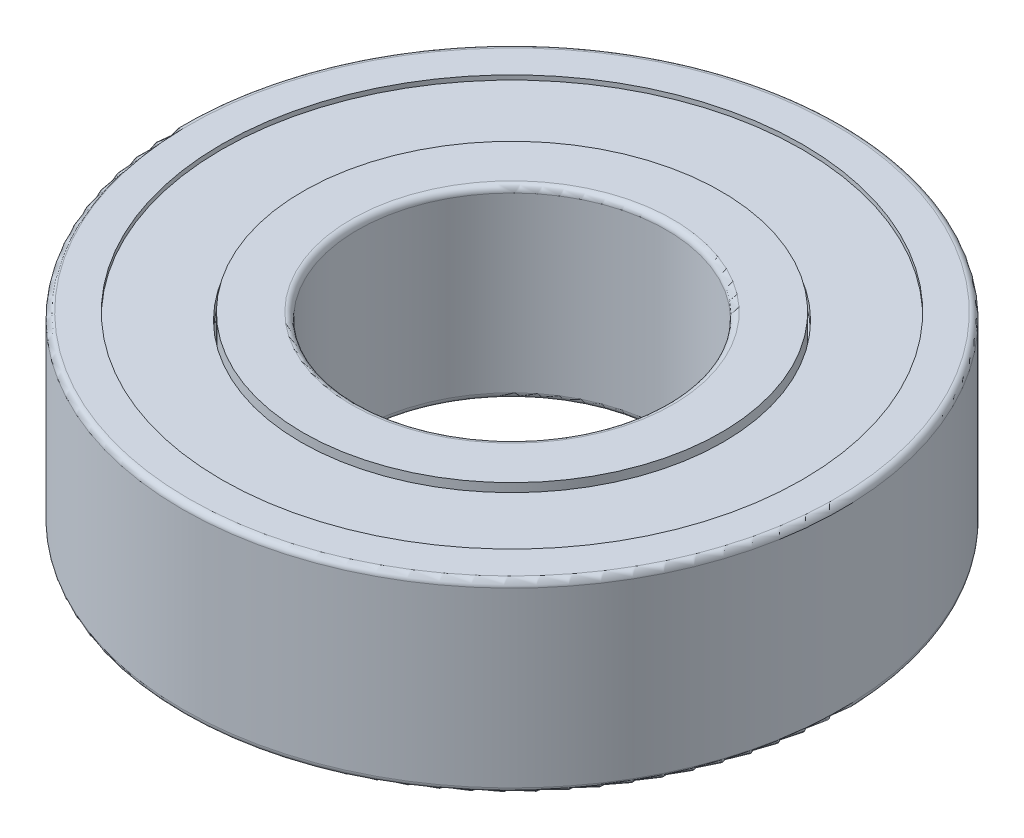
ISO-10303-21;
HEADER;
FILE_DESCRIPTION(('STEP AP214'),'2;1');
FILE_NAME('part.step','',(''),(''),'','','');
FILE_SCHEMA(('AUTOMOTIVE_DESIGN { 1 0 10303 214 1 1 1 1 }'));
ENDSEC;
DATA;
#1=APPLICATION_CONTEXT('core data for automotive mechanical design processes');
#2=APPLICATION_PROTOCOL_DEFINITION('international standard','automotive_design',2000,#1);
#3=PRODUCT_CONTEXT('',#1,'mechanical');
#4=PRODUCT('Part','Part','',(#3));
#5=PRODUCT_RELATED_PRODUCT_CATEGORY('part','',(#4));
#6=PRODUCT_DEFINITION_FORMATION('','',#4);
#7=PRODUCT_DEFINITION_CONTEXT('part definition',#1,'design');
#8=PRODUCT_DEFINITION('design','',#6,#7);
#9=PRODUCT_DEFINITION_SHAPE('','',#8);
#10=(LENGTH_UNIT() NAMED_UNIT(*) SI_UNIT(.MILLI.,.METRE.));
#11=(NAMED_UNIT(*) PLANE_ANGLE_UNIT() SI_UNIT($,.RADIAN.));
#12=(NAMED_UNIT(*) SI_UNIT($,.STERADIAN.) SOLID_ANGLE_UNIT());
#13=UNCERTAINTY_MEASURE_WITH_UNIT(LENGTH_MEASURE(1.E-05),#10,'distance_accuracy_value','');
#14=(GEOMETRIC_REPRESENTATION_CONTEXT(3) GLOBAL_UNCERTAINTY_ASSIGNED_CONTEXT((#13)) GLOBAL_UNIT_ASSIGNED_CONTEXT((#10,
#11,#12)) REPRESENTATION_CONTEXT('',''));
#15=CARTESIAN_POINT('',(0.,0.,0.));
#16=DIRECTION('',(0.,0.,1.));
#17=DIRECTION('',(1.,0.,0.));
#18=AXIS2_PLACEMENT_3D('',#15,#16,#17);
#19=CARTESIAN_POINT('',(-9.00102220664808,0.,7.55275441381673));
#20=DIRECTION('',(0.,1.,0.));
#21=DIRECTION('',(0.766044443118986,0.,-0.64278760968653));
#22=AXIS2_PLACEMENT_3D('',#19,#20,#21);
#23=SPHERICAL_SURFACE('',#22,2.38);
#24=CARTESIAN_POINT('',(-9.00102220664808,2.38,7.55275441381673));
#25=VERTEX_POINT('',#24);
#26=VERTEX_LOOP('',#25);
#27=FACE_BOUND('',#26,.T.);
#28=ADVANCED_FACE('F35',(#27),#23,.T.);
#29=CLOSED_SHELL('',(#28));
#30=MANIFOLD_SOLID_BREP('B2',#29);
#31=CARTESIAN_POINT('',(-2.04036608758655,0.,11.5714910978934));
#32=DIRECTION('',(0.,1.,0.));
#33=DIRECTION('',(0.17364817766694,0.,-0.984807753012206));
#34=AXIS2_PLACEMENT_3D('',#31,#32,#33);
#35=SPHERICAL_SURFACE('',#34,2.38);
#36=CARTESIAN_POINT('',(-2.04036608758655,2.38,11.5714910978934));
#37=VERTEX_POINT('',#36);
#38=VERTEX_LOOP('',#37);
#39=FACE_BOUND('',#38,.T.);
#40=ADVANCED_FACE('F53',(#39),#35,.T.);
#41=CLOSED_SHELL('',(#40));
#42=MANIFOLD_SOLID_BREP('B6',#41);
#43=CARTESIAN_POINT('',(5.87499999999991,0.,10.1757984944672));
#44=DIRECTION('',(0.,1.,0.));
#45=DIRECTION('',(-0.499999999999992,0.,-0.866025403784443));
#46=AXIS2_PLACEMENT_3D('',#43,#44,#45);
#47=SPHERICAL_SURFACE('',#46,2.38);
#48=CARTESIAN_POINT('',(5.87499999999991,2.38,10.1757984944672));
#49=VERTEX_POINT('',#48);
#50=VERTEX_LOOP('',#49);
#51=FACE_BOUND('',#50,.T.);
#52=ADVANCED_FACE('F71',(#51),#47,.T.);
#53=CLOSED_SHELL('',(#52));
#54=MANIFOLD_SOLID_BREP('B31',#53);
#55=CARTESIAN_POINT('',(11.0413882942344,0.,4.01873668407669));
#56=DIRECTION('',(0.,1.,0.));
#57=DIRECTION('',(-0.939692620785906,0.,-0.342020143325676));
#58=AXIS2_PLACEMENT_3D('',#55,#56,#57);
#59=SPHERICAL_SURFACE('',#58,2.38);
#60=CARTESIAN_POINT('',(11.0413882942344,2.38,4.01873668407669));
#61=VERTEX_POINT('',#60);
#62=VERTEX_LOOP('',#61);
#63=FACE_BOUND('',#62,.T.);
#64=ADVANCED_FACE('F89',(#63),#59,.T.);
#65=CLOSED_SHELL('',(#64));
#66=MANIFOLD_SOLID_BREP('B49',#65);
#67=CARTESIAN_POINT('',(11.0413882942344,0.,-4.01873668407654));
#68=DIRECTION('',(0.,1.,0.));
#69=DIRECTION('',(-0.939692620785911,0.,0.342020143325663));
#70=AXIS2_PLACEMENT_3D('',#67,#68,#69);
#71=SPHERICAL_SURFACE('',#70,2.38);
#72=CARTESIAN_POINT('',(11.0413882942344,2.38,-4.01873668407654));
#73=VERTEX_POINT('',#72);
#74=VERTEX_LOOP('',#73);
#75=FACE_BOUND('',#74,.T.);
#76=ADVANCED_FACE('F107',(#75),#71,.T.);
#77=CLOSED_SHELL('',(#76));
#78=MANIFOLD_SOLID_BREP('B67',#77);
#79=CARTESIAN_POINT('',(5.87500000000005,0.,-10.1757984944671));
#80=DIRECTION('',(0.,1.,0.));
#81=DIRECTION('',(-0.500000000000004,0.,0.866025403784436));
#82=AXIS2_PLACEMENT_3D('',#79,#80,#81);
#83=SPHERICAL_SURFACE('',#82,2.38);
#84=CARTESIAN_POINT('',(5.87500000000005,2.38,-10.1757984944671));
#85=VERTEX_POINT('',#84);
#86=VERTEX_LOOP('',#85);
#87=FACE_BOUND('',#86,.T.);
#88=ADVANCED_FACE('F125',(#87),#83,.T.);
#89=CLOSED_SHELL('',(#88));
#90=MANIFOLD_SOLID_BREP('B85',#89);
#91=CARTESIAN_POINT('',(-2.0403660875864,0.,-11.5714910978934));
#92=DIRECTION('',(0.,1.,0.));
#93=DIRECTION('',(0.173648177666927,0.,0.984807753012209));
#94=AXIS2_PLACEMENT_3D('',#91,#92,#93);
#95=SPHERICAL_SURFACE('',#94,2.38);
#96=CARTESIAN_POINT('',(-2.0403660875864,2.38,-11.5714910978934));
#97=VERTEX_POINT('',#96);
#98=VERTEX_LOOP('',#97);
#99=FACE_BOUND('',#98,.T.);
#100=ADVANCED_FACE('F143',(#99),#95,.T.);
#101=CLOSED_SHELL('',(#100));
#102=MANIFOLD_SOLID_BREP('B103',#101);
#103=CARTESIAN_POINT('',(-9.00102220664798,0.,-7.55275441381685));
#104=DIRECTION('',(0.,1.,0.));
#105=DIRECTION('',(0.766044443118977,0.,0.642787609686541));
#106=AXIS2_PLACEMENT_3D('',#103,#104,#105);
#107=SPHERICAL_SURFACE('',#106,2.38);
#108=CARTESIAN_POINT('',(-9.00102220664798,2.38,-7.55275441381685));
#109=VERTEX_POINT('',#108);
#110=VERTEX_LOOP('',#109);
#111=FACE_BOUND('',#110,.T.);
#112=ADVANCED_FACE('F163',(#111),#107,.T.);
#113=CLOSED_SHELL('',(#112));
#114=MANIFOLD_SOLID_BREP('B121',#113);
#115=CARTESIAN_POINT('',(0.,4.95,0.));
#116=DIRECTION('',(0.,1.,0.));
#117=DIRECTION('',(0.,0.,1.));
#118=AXIS2_PLACEMENT_3D('',#115,#116,#117);
#119=CYLINDRICAL_SURFACE('',#118,14.1);
#120=CARTESIAN_POINT('',(0.,-4.5,0.));
#121=DIRECTION('',(0.,1.,0.));
#122=DIRECTION('',(0.,0.,1.));
#123=AXIS2_PLACEMENT_3D('',#120,#121,#122);
#124=CIRCLE('',#123,14.1);
#125=CARTESIAN_POINT('',(0.,-4.5,14.1));
#126=VERTEX_POINT('',#125);
#127=EDGE_CURVE('E209',#126,#126,#124,.T.);
#128=ORIENTED_EDGE('',*,*,#127,.F.);
#129=EDGE_LOOP('',(#128));
#130=FACE_BOUND('',#129,.T.);
#131=CARTESIAN_POINT('',(0.,-4.28,0.));
#132=DIRECTION('',(0.,1.,0.));
#133=DIRECTION('',(0.,0.,1.));
#134=AXIS2_PLACEMENT_3D('',#131,#132,#133);
#135=CIRCLE('',#134,14.1);
#136=CARTESIAN_POINT('',(0.,-4.28,14.1));
#137=VERTEX_POINT('',#136);
#138=EDGE_CURVE('E241',#137,#137,#135,.T.);
#139=ORIENTED_EDGE('',*,*,#138,.T.);
#140=EDGE_LOOP('',(#139));
#141=FACE_BOUND('',#140,.T.);
#142=ADVANCED_FACE('F183',(#130,#141),#119,.F.);
#143=CARTESIAN_POINT('',(0.,-3.995,0.));
#144=DIRECTION('',(0.,1.,0.));
#145=DIRECTION('',(0.,0.,1.));
#146=AXIS2_PLACEMENT_3D('',#143,#144,#145);
#147=TOROIDAL_SURFACE('',#146,14.1,0.285);
#148=CARTESIAN_POINT('',(0.,-4.15,0.));
#149=DIRECTION('',(0.,-1.,0.));
#150=DIRECTION('',(0.,0.,-1.));
#151=AXIS2_PLACEMENT_3D('',#148,#149,#150);
#152=CIRCLE('',#151,14.339165214862);
#153=CARTESIAN_POINT('',(0.,-4.15,-14.339165214862));
#154=VERTEX_POINT('',#153);
#155=EDGE_CURVE('E162',#154,#154,#152,.T.);
#156=ORIENTED_EDGE('',*,*,#155,.F.);
#157=EDGE_LOOP('',(#156));
#158=FACE_BOUND('',#157,.T.);
#159=ORIENTED_EDGE('',*,*,#138,.F.);
#160=EDGE_LOOP('',(#159));
#161=FACE_BOUND('',#160,.T.);
#162=ADVANCED_FACE('F267',(#158,#161),#147,.F.);
#163=CARTESIAN_POINT('',(0.,4.95,0.));
#164=DIRECTION('',(0.,1.,0.));
#165=DIRECTION('',(0.,0.,1.));
#166=AXIS2_PLACEMENT_3D('',#163,#164,#165);
#167=CYLINDRICAL_SURFACE('',#166,13.35);
#168=CARTESIAN_POINT('',(0.,-3.58,0.));
#169=DIRECTION('',(0.,1.,0.));
#170=DIRECTION('',(0.,0.,1.));
#171=AXIS2_PLACEMENT_3D('',#168,#169,#170);
#172=CIRCLE('',#171,13.35);
#173=CARTESIAN_POINT('',(0.,-3.58,13.35));
#174=VERTEX_POINT('',#173);
#175=EDGE_CURVE('E238',#174,#174,#172,.T.);
#176=ORIENTED_EDGE('',*,*,#175,.F.);
#177=EDGE_LOOP('',(#176));
#178=FACE_BOUND('',#177,.T.);
#179=CARTESIAN_POINT('',(0.,-1.76867888549618,0.));
#180=DIRECTION('',(0.,1.,0.));
#181=DIRECTION('',(0.,0.,1.));
#182=AXIS2_PLACEMENT_3D('',#179,#180,#181);
#183=CIRCLE('',#182,13.35);
#184=CARTESIAN_POINT('',(0.,-1.76867888549618,13.35));
#185=VERTEX_POINT('',#184);
#186=EDGE_CURVE('E235',#185,#185,#183,.T.);
#187=ORIENTED_EDGE('',*,*,#186,.T.);
#188=EDGE_LOOP('',(#187));
#189=FACE_BOUND('',#188,.T.);
#190=ADVANCED_FACE('F272',(#178,#189),#167,.F.);
#191=CARTESIAN_POINT('',(0.,0.,0.));
#192=DIRECTION('',(0.,1.,0.));
#193=DIRECTION('',(0.,0.,1.));
#194=AXIS2_PLACEMENT_3D('',#191,#192,#193);
#195=TOROIDAL_SURFACE('',#194,11.75,2.385);
#196=ORIENTED_EDGE('',*,*,#186,.F.);
#197=EDGE_LOOP('',(#196));
#198=FACE_BOUND('',#197,.T.);
#199=CARTESIAN_POINT('',(0.,1.76867888549618,0.));
#200=DIRECTION('',(0.,1.,0.));
#201=DIRECTION('',(0.,0.,1.));
#202=AXIS2_PLACEMENT_3D('',#199,#200,#201);
#203=CIRCLE('',#202,13.35);
#204=CARTESIAN_POINT('',(0.,1.76867888549618,13.35));
#205=VERTEX_POINT('',#204);
#206=EDGE_CURVE('E232',#205,#205,#203,.T.);
#207=ORIENTED_EDGE('',*,*,#206,.T.);
#208=EDGE_LOOP('',(#207));
#209=FACE_BOUND('',#208,.T.);
#210=ADVANCED_FACE('F280',(#198,#209),#195,.F.);
#211=CARTESIAN_POINT('',(0.,4.95,0.));
#212=DIRECTION('',(0.,1.,0.));
#213=DIRECTION('',(0.,0.,1.));
#214=AXIS2_PLACEMENT_3D('',#211,#212,#213);
#215=CYLINDRICAL_SURFACE('',#214,13.35);
#216=ORIENTED_EDGE('',*,*,#206,.F.);
#217=EDGE_LOOP('',(#216));
#218=FACE_BOUND('',#217,.T.);
#219=CARTESIAN_POINT('',(0.,3.58,0.));
#220=DIRECTION('',(0.,-1.,0.));
#221=DIRECTION('',(0.,0.,-1.));
#222=AXIS2_PLACEMENT_3D('',#219,#220,#221);
#223=CIRCLE('',#222,13.35);
#224=CARTESIAN_POINT('',(0.,3.58,-13.35));
#225=VERTEX_POINT('',#224);
#226=EDGE_CURVE('E204',#225,#225,#223,.T.);
#227=ORIENTED_EDGE('',*,*,#226,.F.);
#228=EDGE_LOOP('',(#227));
#229=FACE_BOUND('',#228,.T.);
#230=ADVANCED_FACE('F284',(#218,#229),#215,.F.);
#231=CARTESIAN_POINT('',(0.,3.995,0.));
#232=DIRECTION('',(0.,1.,0.));
#233=DIRECTION('',(0.,0.,1.));
#234=AXIS2_PLACEMENT_3D('',#231,#232,#233);
#235=TOROIDAL_SURFACE('',#234,14.38,0.285);
#236=CARTESIAN_POINT('',(0.,3.7100438630245,0.));
#237=DIRECTION('',(0.,1.,0.));
#238=DIRECTION('',(0.,0.,1.));
#239=AXIS2_PLACEMENT_3D('',#236,#237,#238);
#240=CIRCLE('',#239,14.385);
#241=CARTESIAN_POINT('',(0.,3.7100438630245,14.385));
#242=VERTEX_POINT('',#241);
#243=EDGE_CURVE('E202',#242,#242,#240,.F.);
#244=ORIENTED_EDGE('',*,*,#243,.T.);
#245=EDGE_LOOP('',(#244));
#246=FACE_BOUND('',#245,.T.);
#247=CARTESIAN_POINT('',(0.,4.28,0.));
#248=DIRECTION('',(0.,1.,0.));
#249=DIRECTION('',(0.,0.,1.));
#250=AXIS2_PLACEMENT_3D('',#247,#248,#249);
#251=CIRCLE('',#250,14.38);
#252=CARTESIAN_POINT('',(0.,4.28,14.38));
#253=VERTEX_POINT('',#252);
#254=EDGE_CURVE('E229',#253,#253,#251,.T.);
#255=ORIENTED_EDGE('',*,*,#254,.T.);
#256=EDGE_LOOP('',(#255));
#257=FACE_BOUND('',#256,.T.);
#258=ADVANCED_FACE('F288',(#246,#257),#235,.F.);
#259=CARTESIAN_POINT('',(0.,4.28,0.));
#260=DIRECTION('',(0.,-1.,0.));
#261=DIRECTION('',(0.,0.,-1.));
#262=AXIS2_PLACEMENT_3D('',#259,#260,#261);
#263=PLANE('',#262);
#264=CARTESIAN_POINT('',(0.,4.28,0.));
#265=DIRECTION('',(0.,1.,0.));
#266=DIRECTION('',(0.,0.,1.));
#267=AXIS2_PLACEMENT_3D('',#264,#265,#266);
#268=CIRCLE('',#267,14.1);
#269=CARTESIAN_POINT('',(0.,4.28,14.1));
#270=VERTEX_POINT('',#269);
#271=EDGE_CURVE('E226',#270,#270,#268,.T.);
#272=ORIENTED_EDGE('',*,*,#271,.T.);
#273=EDGE_LOOP('',(#272));
#274=FACE_BOUND('',#273,.T.);
#275=ORIENTED_EDGE('',*,*,#254,.F.);
#276=EDGE_LOOP('',(#275));
#277=FACE_BOUND('',#276,.T.);
#278=ADVANCED_FACE('F292',(#274,#277),#263,.T.);
#279=CARTESIAN_POINT('',(0.,4.95,0.));
#280=DIRECTION('',(0.,1.,0.));
#281=DIRECTION('',(0.,0.,1.));
#282=AXIS2_PLACEMENT_3D('',#279,#280,#281);
#283=CYLINDRICAL_SURFACE('',#282,14.1);
#284=CARTESIAN_POINT('',(0.,4.5,0.));
#285=DIRECTION('',(0.,1.,0.));
#286=DIRECTION('',(0.,0.,1.));
#287=AXIS2_PLACEMENT_3D('',#284,#285,#286);
#288=CIRCLE('',#287,14.1);
#289=CARTESIAN_POINT('',(0.,4.5,14.1));
#290=VERTEX_POINT('',#289);
#291=EDGE_CURVE('E223',#290,#290,#288,.T.);
#292=ORIENTED_EDGE('',*,*,#291,.T.);
#293=EDGE_LOOP('',(#292));
#294=FACE_BOUND('',#293,.T.);
#295=ORIENTED_EDGE('',*,*,#271,.F.);
#296=EDGE_LOOP('',(#295));
#297=FACE_BOUND('',#296,.T.);
#298=ADVANCED_FACE('F295',(#294,#297),#283,.F.);
#299=CARTESIAN_POINT('',(0.,4.5,0.));
#300=DIRECTION('',(0.,1.,0.));
#301=DIRECTION('',(0.,0.,1.));
#302=AXIS2_PLACEMENT_3D('',#299,#300,#301);
#303=PLANE('',#302);
#304=CARTESIAN_POINT('',(0.,4.5,0.));
#305=DIRECTION('',(0.,1.,0.));
#306=DIRECTION('',(0.,0.,1.));
#307=AXIS2_PLACEMENT_3D('',#304,#305,#306);
#308=CIRCLE('',#307,15.7);
#309=CARTESIAN_POINT('',(0.,4.5,15.7));
#310=VERTEX_POINT('',#309);
#311=EDGE_CURVE('E190',#310,#310,#308,.T.);
#312=ORIENTED_EDGE('',*,*,#311,.T.);
#313=EDGE_LOOP('',(#312));
#314=FACE_BOUND('',#313,.T.);
#315=ORIENTED_EDGE('',*,*,#291,.F.);
#316=EDGE_LOOP('',(#315));
#317=FACE_BOUND('',#316,.T.);
#318=ADVANCED_FACE('F299',(#314,#317),#303,.T.);
#319=CARTESIAN_POINT('',(0.,4.95,0.));
#320=DIRECTION('',(0.,1.,0.));
#321=DIRECTION('',(0.,0.,1.));
#322=AXIS2_PLACEMENT_3D('',#319,#320,#321);
#323=CYLINDRICAL_SURFACE('',#322,16.);
#324=CARTESIAN_POINT('',(0.,-4.2,0.));
#325=DIRECTION('',(0.,1.,0.));
#326=DIRECTION('',(0.,0.,1.));
#327=AXIS2_PLACEMENT_3D('',#324,#325,#326);
#328=CIRCLE('',#327,16.);
#329=CARTESIAN_POINT('',(0.,-4.2,16.));
#330=VERTEX_POINT('',#329);
#331=EDGE_CURVE('E199',#330,#330,#328,.T.);
#332=ORIENTED_EDGE('',*,*,#331,.T.);
#333=EDGE_LOOP('',(#332));
#334=FACE_BOUND('',#333,.T.);
#335=CARTESIAN_POINT('',(0.,4.2,0.));
#336=DIRECTION('',(0.,1.,0.));
#337=DIRECTION('',(0.,0.,1.));
#338=AXIS2_PLACEMENT_3D('',#335,#336,#337);
#339=CIRCLE('',#338,16.);
#340=CARTESIAN_POINT('',(0.,4.2,16.));
#341=VERTEX_POINT('',#340);
#342=EDGE_CURVE('E244',#341,#341,#339,.F.);
#343=ORIENTED_EDGE('',*,*,#342,.T.);
#344=EDGE_LOOP('',(#343));
#345=FACE_BOUND('',#344,.T.);
#346=ADVANCED_FACE('F249',(#334,#345),#323,.T.);
#347=CARTESIAN_POINT('',(0.,-4.5,0.));
#348=DIRECTION('',(0.,1.,0.));
#349=DIRECTION('',(0.,0.,1.));
#350=AXIS2_PLACEMENT_3D('',#347,#348,#349);
#351=PLANE('',#350);
#352=CARTESIAN_POINT('',(0.,-4.5,0.));
#353=DIRECTION('',(0.,1.,0.));
#354=DIRECTION('',(0.,0.,1.));
#355=AXIS2_PLACEMENT_3D('',#352,#353,#354);
#356=CIRCLE('',#355,15.7);
#357=CARTESIAN_POINT('',(0.,-4.5,15.7));
#358=VERTEX_POINT('',#357);
#359=EDGE_CURVE('E194',#358,#358,#356,.F.);
#360=ORIENTED_EDGE('',*,*,#359,.T.);
#361=EDGE_LOOP('',(#360));
#362=FACE_BOUND('',#361,.T.);
#363=ORIENTED_EDGE('',*,*,#127,.T.);
#364=EDGE_LOOP('',(#363));
#365=FACE_BOUND('',#364,.T.);
#366=ADVANCED_FACE('F254',(#362,#365),#351,.F.);
#367=CARTESIAN_POINT('',(0.,-4.2,0.));
#368=DIRECTION('',(0.,1.,0.));
#369=DIRECTION('',(0.,0.,1.));
#370=AXIS2_PLACEMENT_3D('',#367,#368,#369);
#371=TOROIDAL_SURFACE('',#370,15.7,0.3);
#372=ORIENTED_EDGE('',*,*,#359,.F.);
#373=EDGE_LOOP('',(#372));
#374=FACE_BOUND('',#373,.T.);
#375=ORIENTED_EDGE('',*,*,#331,.F.);
#376=EDGE_LOOP('',(#375));
#377=FACE_BOUND('',#376,.T.);
#378=ADVANCED_FACE('F252',(#374,#377),#371,.T.);
#379=CARTESIAN_POINT('',(0.,4.2,0.));
#380=DIRECTION('',(0.,1.,0.));
#381=DIRECTION('',(0.,0.,1.));
#382=AXIS2_PLACEMENT_3D('',#379,#380,#381);
#383=TOROIDAL_SURFACE('',#382,15.7,0.3);
#384=ORIENTED_EDGE('',*,*,#342,.F.);
#385=EDGE_LOOP('',(#384));
#386=FACE_BOUND('',#385,.T.);
#387=ORIENTED_EDGE('',*,*,#311,.F.);
#388=EDGE_LOOP('',(#387));
#389=FACE_BOUND('',#388,.T.);
#390=ADVANCED_FACE('F185',(#386,#389),#383,.T.);
#391=CARTESIAN_POINT('',(0.,3.58,0.));
#392=DIRECTION('',(0.,-1.,0.));
#393=DIRECTION('',(0.,0.,-1.));
#394=AXIS2_PLACEMENT_3D('',#391,#392,#393);
#395=PLANE('',#394);
#396=CARTESIAN_POINT('',(0.,3.58,0.));
#397=DIRECTION('',(0.,-1.,0.));
#398=DIRECTION('',(0.,0.,-1.));
#399=AXIS2_PLACEMENT_3D('',#396,#397,#398);
#400=CIRCLE('',#399,10.25);
#401=CARTESIAN_POINT('',(0.,3.58,-10.25));
#402=VERTEX_POINT('',#401);
#403=EDGE_CURVE('E217',#402,#402,#400,.T.);
#404=ORIENTED_EDGE('',*,*,#403,.F.);
#405=EDGE_LOOP('',(#404));
#406=FACE_BOUND('',#405,.T.);
#407=ORIENTED_EDGE('',*,*,#226,.T.);
#408=EDGE_LOOP('',(#407));
#409=FACE_BOUND('',#408,.T.);
#410=ADVANCED_FACE('F260',(#406,#409),#395,.T.);
#411=CARTESIAN_POINT('',(0.,4.15,0.));
#412=DIRECTION('',(0.,-1.,0.));
#413=DIRECTION('',(0.,0.,-1.));
#414=AXIS2_PLACEMENT_3D('',#411,#412,#413);
#415=CYLINDRICAL_SURFACE('',#414,14.385);
#416=CARTESIAN_POINT('',(0.,4.15,0.));
#417=DIRECTION('',(0.,-1.,0.));
#418=DIRECTION('',(0.,0.,-1.));
#419=AXIS2_PLACEMENT_3D('',#416,#417,#418);
#420=CIRCLE('',#419,14.385);
#421=CARTESIAN_POINT('',(0.,4.15,-14.385));
#422=VERTEX_POINT('',#421);
#423=EDGE_CURVE('E205',#422,#422,#420,.T.);
#424=ORIENTED_EDGE('',*,*,#423,.T.);
#425=EDGE_LOOP('',(#424));
#426=FACE_BOUND('',#425,.T.);
#427=ORIENTED_EDGE('',*,*,#243,.F.);
#428=EDGE_LOOP('',(#427));
#429=FACE_BOUND('',#428,.T.);
#430=ADVANCED_FACE('F305',(#426,#429),#415,.T.);
#431=CARTESIAN_POINT('',(0.,4.15,0.));
#432=DIRECTION('',(0.,-1.,0.));
#433=DIRECTION('',(0.,0.,-1.));
#434=AXIS2_PLACEMENT_3D('',#431,#432,#433);
#435=PLANE('',#434);
#436=CARTESIAN_POINT('',(0.,4.15,0.));
#437=DIRECTION('',(0.,-1.,0.));
#438=DIRECTION('',(0.,0.,-1.));
#439=AXIS2_PLACEMENT_3D('',#436,#437,#438);
#440=CIRCLE('',#439,10.25);
#441=CARTESIAN_POINT('',(0.,4.15,-10.25));
#442=VERTEX_POINT('',#441);
#443=EDGE_CURVE('E212',#442,#442,#440,.T.);
#444=ORIENTED_EDGE('',*,*,#443,.T.);
#445=EDGE_LOOP('',(#444));
#446=FACE_BOUND('',#445,.T.);
#447=ORIENTED_EDGE('',*,*,#423,.F.);
#448=EDGE_LOOP('',(#447));
#449=FACE_BOUND('',#448,.T.);
#450=ADVANCED_FACE('F308',(#446,#449),#435,.F.);
#451=CARTESIAN_POINT('',(0.,4.15,0.));
#452=DIRECTION('',(0.,-1.,0.));
#453=DIRECTION('',(0.,0.,-1.));
#454=AXIS2_PLACEMENT_3D('',#451,#452,#453);
#455=CYLINDRICAL_SURFACE('',#454,10.25);
#456=ORIENTED_EDGE('',*,*,#443,.F.);
#457=EDGE_LOOP('',(#456));
#458=FACE_BOUND('',#457,.T.);
#459=ORIENTED_EDGE('',*,*,#403,.T.);
#460=EDGE_LOOP('',(#459));
#461=FACE_BOUND('',#460,.T.);
#462=ADVANCED_FACE('F314',(#458,#461),#455,.F.);
#463=CARTESIAN_POINT('',(0.,-4.15,0.));
#464=DIRECTION('',(0.,-1.,0.));
#465=DIRECTION('',(0.,0.,-1.));
#466=AXIS2_PLACEMENT_3D('',#463,#464,#465);
#467=PLANE('',#466);
#468=CARTESIAN_POINT('',(0.,-4.15,0.));
#469=DIRECTION('',(0.,-1.,0.));
#470=DIRECTION('',(0.,0.,-1.));
#471=AXIS2_PLACEMENT_3D('',#468,#469,#470);
#472=CIRCLE('',#471,10.25);
#473=CARTESIAN_POINT('',(0.,-4.15,-10.25));
#474=VERTEX_POINT('',#473);
#475=EDGE_CURVE('E335',#474,#474,#472,.T.);
#476=ORIENTED_EDGE('',*,*,#475,.F.);
#477=EDGE_LOOP('',(#476));
#478=FACE_BOUND('',#477,.T.);
#479=ORIENTED_EDGE('',*,*,#155,.T.);
#480=EDGE_LOOP('',(#479));
#481=FACE_BOUND('',#480,.T.);
#482=ADVANCED_FACE('F318',(#478,#481),#467,.T.);
#483=CARTESIAN_POINT('',(0.,-3.58,0.));
#484=DIRECTION('',(0.,-1.,0.));
#485=DIRECTION('',(0.,0.,-1.));
#486=AXIS2_PLACEMENT_3D('',#483,#484,#485);
#487=PLANE('',#486);
#488=CARTESIAN_POINT('',(0.,-3.58,0.));
#489=DIRECTION('',(0.,-1.,0.));
#490=DIRECTION('',(0.,0.,-1.));
#491=AXIS2_PLACEMENT_3D('',#488,#489,#490);
#492=CIRCLE('',#491,10.25);
#493=CARTESIAN_POINT('',(0.,-3.58,-10.25));
#494=VERTEX_POINT('',#493);
#495=EDGE_CURVE('E338',#494,#494,#492,.T.);
#496=ORIENTED_EDGE('',*,*,#495,.T.);
#497=EDGE_LOOP('',(#496));
#498=FACE_BOUND('',#497,.T.);
#499=ORIENTED_EDGE('',*,*,#175,.T.);
#500=EDGE_LOOP('',(#499));
#501=FACE_BOUND('',#500,.T.);
#502=ADVANCED_FACE('F320',(#498,#501),#487,.F.);
#503=CARTESIAN_POINT('',(0.,-4.15,0.));
#504=DIRECTION('',(0.,1.,0.));
#505=DIRECTION('',(0.,0.,1.));
#506=AXIS2_PLACEMENT_3D('',#503,#504,#505);
#507=CYLINDRICAL_SURFACE('',#506,10.25);
#508=ORIENTED_EDGE('',*,*,#475,.T.);
#509=EDGE_LOOP('',(#508));
#510=FACE_BOUND('',#509,.T.);
#511=ORIENTED_EDGE('',*,*,#495,.F.);
#512=EDGE_LOOP('',(#511));
#513=FACE_BOUND('',#512,.T.);
#514=ADVANCED_FACE('F323',(#510,#513),#507,.F.);
#515=CLOSED_SHELL('',(#142,#162,#190,#210,#230,#258,#278,#298,#318,#346,#366,#378,#390,#410,
#430,#450,#462,#482,#502,#514));
#516=MANIFOLD_SOLID_BREP('B139',#515);
#517=CARTESIAN_POINT('',(0.,0.,0.));
#518=DIRECTION('',(0.,1.,0.));
#519=DIRECTION('',(0.,0.,1.));
#520=AXIS2_PLACEMENT_3D('',#517,#518,#519);
#521=TOROIDAL_SURFACE('',#520,11.75,2.385);
#522=CARTESIAN_POINT('',(0.,1.76867888549617,0.));
#523=DIRECTION('',(0.,1.,0.));
#524=DIRECTION('',(0.,0.,1.));
#525=AXIS2_PLACEMENT_3D('',#522,#523,#524);
#526=CIRCLE('',#525,10.15);
#527=CARTESIAN_POINT('',(0.,1.76867888549617,10.15));
#528=VERTEX_POINT('',#527);
#529=EDGE_CURVE('E518',#528,#528,#526,.T.);
#530=ORIENTED_EDGE('',*,*,#529,.F.);
#531=EDGE_LOOP('',(#530));
#532=FACE_BOUND('',#531,.T.);
#533=CARTESIAN_POINT('',(0.,-1.76867888549618,0.));
#534=DIRECTION('',(0.,1.,0.));
#535=DIRECTION('',(0.,0.,1.));
#536=AXIS2_PLACEMENT_3D('',#533,#534,#535);
#537=CIRCLE('',#536,10.15);
#538=CARTESIAN_POINT('',(0.,-1.76867888549618,10.15));
#539=VERTEX_POINT('',#538);
#540=EDGE_CURVE('E509',#539,#539,#537,.T.);
#541=ORIENTED_EDGE('',*,*,#540,.T.);
#542=EDGE_LOOP('',(#541));
#543=FACE_BOUND('',#542,.T.);
#544=ADVANCED_FACE('F489',(#532,#543),#521,.F.);
#545=CARTESIAN_POINT('',(0.,4.95,0.));
#546=DIRECTION('',(0.,1.,0.));
#547=DIRECTION('',(0.,0.,1.));
#548=AXIS2_PLACEMENT_3D('',#545,#546,#547);
#549=CYLINDRICAL_SURFACE('',#548,10.15);
#550=CARTESIAN_POINT('',(0.,-4.5,0.));
#551=DIRECTION('',(0.,1.,0.));
#552=DIRECTION('',(0.,0.,1.));
#553=AXIS2_PLACEMENT_3D('',#550,#551,#552);
#554=CIRCLE('',#553,10.15);
#555=CARTESIAN_POINT('',(0.,-4.5,10.15));
#556=VERTEX_POINT('',#555);
#557=EDGE_CURVE('E512',#556,#556,#554,.T.);
#558=ORIENTED_EDGE('',*,*,#557,.T.);
#559=EDGE_LOOP('',(#558));
#560=FACE_BOUND('',#559,.T.);
#561=ORIENTED_EDGE('',*,*,#540,.F.);
#562=EDGE_LOOP('',(#561));
#563=FACE_BOUND('',#562,.T.);
#564=ADVANCED_FACE('F527',(#560,#563),#549,.T.);
#565=CARTESIAN_POINT('',(0.,-4.5,0.));
#566=DIRECTION('',(0.,1.,0.));
#567=DIRECTION('',(0.,0.,1.));
#568=AXIS2_PLACEMENT_3D('',#565,#566,#567);
#569=PLANE('',#568);
#570=CARTESIAN_POINT('',(0.,-4.5,0.));
#571=DIRECTION('',(0.,1.,0.));
#572=DIRECTION('',(0.,0.,1.));
#573=AXIS2_PLACEMENT_3D('',#570,#571,#572);
#574=CIRCLE('',#573,7.8);
#575=CARTESIAN_POINT('',(0.,-4.5,7.8));
#576=VERTEX_POINT('',#575);
#577=EDGE_CURVE('E182',#576,#576,#574,.T.);
#578=ORIENTED_EDGE('',*,*,#577,.T.);
#579=EDGE_LOOP('',(#578));
#580=FACE_BOUND('',#579,.T.);
#581=ORIENTED_EDGE('',*,*,#557,.F.);
#582=EDGE_LOOP('',(#581));
#583=FACE_BOUND('',#582,.T.);
#584=ADVANCED_FACE('F532',(#580,#583),#569,.F.);
#585=CARTESIAN_POINT('',(0.,4.95,0.));
#586=DIRECTION('',(0.,1.,0.));
#587=DIRECTION('',(0.,0.,1.));
#588=AXIS2_PLACEMENT_3D('',#585,#586,#587);
#589=CYLINDRICAL_SURFACE('',#588,7.5);
#590=CARTESIAN_POINT('',(0.,4.2,0.));
#591=DIRECTION('',(0.,1.,0.));
#592=DIRECTION('',(0.,0.,1.));
#593=AXIS2_PLACEMENT_3D('',#590,#591,#592);
#594=CIRCLE('',#593,7.5);
#595=CARTESIAN_POINT('',(0.,4.2,7.5));
#596=VERTEX_POINT('',#595);
#597=EDGE_CURVE('E500',#596,#596,#594,.T.);
#598=ORIENTED_EDGE('',*,*,#597,.T.);
#599=EDGE_LOOP('',(#598));
#600=FACE_BOUND('',#599,.T.);
#601=CARTESIAN_POINT('',(0.,-4.2,0.));
#602=DIRECTION('',(0.,1.,0.));
#603=DIRECTION('',(0.,0.,1.));
#604=AXIS2_PLACEMENT_3D('',#601,#602,#603);
#605=CIRCLE('',#604,7.5);
#606=CARTESIAN_POINT('',(0.,-4.2,7.5));
#607=VERTEX_POINT('',#606);
#608=EDGE_CURVE('E504',#607,#607,#605,.F.);
#609=ORIENTED_EDGE('',*,*,#608,.T.);
#610=EDGE_LOOP('',(#609));
#611=FACE_BOUND('',#610,.T.);
#612=ADVANCED_FACE('F538',(#600,#611),#589,.F.);
#613=CARTESIAN_POINT('',(0.,4.5,0.));
#614=DIRECTION('',(0.,1.,0.));
#615=DIRECTION('',(0.,0.,1.));
#616=AXIS2_PLACEMENT_3D('',#613,#614,#615);
#617=PLANE('',#616);
#618=CARTESIAN_POINT('',(0.,4.5,0.));
#619=DIRECTION('',(0.,1.,0.));
#620=DIRECTION('',(0.,0.,1.));
#621=AXIS2_PLACEMENT_3D('',#618,#619,#620);
#622=CIRCLE('',#621,7.8);
#623=CARTESIAN_POINT('',(0.,4.5,7.8));
#624=VERTEX_POINT('',#623);
#625=EDGE_CURVE('E496',#624,#624,#622,.F.);
#626=ORIENTED_EDGE('',*,*,#625,.T.);
#627=EDGE_LOOP('',(#626));
#628=FACE_BOUND('',#627,.T.);
#629=CARTESIAN_POINT('',(0.,4.5,0.));
#630=DIRECTION('',(0.,1.,0.));
#631=DIRECTION('',(0.,0.,1.));
#632=AXIS2_PLACEMENT_3D('',#629,#630,#631);
#633=CIRCLE('',#632,10.15);
#634=CARTESIAN_POINT('',(0.,4.5,10.15));
#635=VERTEX_POINT('',#634);
#636=EDGE_CURVE('E515',#635,#635,#633,.T.);
#637=ORIENTED_EDGE('',*,*,#636,.T.);
#638=EDGE_LOOP('',(#637));
#639=FACE_BOUND('',#638,.T.);
#640=ADVANCED_FACE('F549',(#628,#639),#617,.T.);
#641=CARTESIAN_POINT('',(0.,4.95,0.));
#642=DIRECTION('',(0.,1.,0.));
#643=DIRECTION('',(0.,0.,1.));
#644=AXIS2_PLACEMENT_3D('',#641,#642,#643);
#645=CYLINDRICAL_SURFACE('',#644,10.15);
#646=ORIENTED_EDGE('',*,*,#529,.T.);
#647=EDGE_LOOP('',(#646));
#648=FACE_BOUND('',#647,.T.);
#649=ORIENTED_EDGE('',*,*,#636,.F.);
#650=EDGE_LOOP('',(#649));
#651=FACE_BOUND('',#650,.T.);
#652=ADVANCED_FACE('F522',(#648,#651),#645,.T.);
#653=CARTESIAN_POINT('',(0.,4.2,0.));
#654=DIRECTION('',(0.,1.,0.));
#655=DIRECTION('',(0.,0.,1.));
#656=AXIS2_PLACEMENT_3D('',#653,#654,#655);
#657=TOROIDAL_SURFACE('',#656,7.8,0.3);
#658=ORIENTED_EDGE('',*,*,#625,.F.);
#659=EDGE_LOOP('',(#658));
#660=FACE_BOUND('',#659,.T.);
#661=ORIENTED_EDGE('',*,*,#597,.F.);
#662=EDGE_LOOP('',(#661));
#663=FACE_BOUND('',#662,.T.);
#664=ADVANCED_FACE('F541',(#660,#663),#657,.T.);
#665=CARTESIAN_POINT('',(0.,-4.2,0.));
#666=DIRECTION('',(0.,1.,0.));
#667=DIRECTION('',(0.,0.,1.));
#668=AXIS2_PLACEMENT_3D('',#665,#666,#667);
#669=TOROIDAL_SURFACE('',#668,7.8,0.3);
#670=ORIENTED_EDGE('',*,*,#608,.F.);
#671=EDGE_LOOP('',(#670));
#672=FACE_BOUND('',#671,.T.);
#673=ORIENTED_EDGE('',*,*,#577,.F.);
#674=EDGE_LOOP('',(#673));
#675=FACE_BOUND('',#674,.T.);
#676=ADVANCED_FACE('F491',(#672,#675),#669,.T.);
#677=CLOSED_SHELL('',(#544,#564,#584,#612,#640,#652,#664,#676));
#678=MANIFOLD_SOLID_BREP('B157',#677);
#679=CARTESIAN_POINT('',(-11.75,0.,0.));
#680=DIRECTION('',(0.,1.,0.));
#681=DIRECTION('',(1.,0.,0.));
#682=AXIS2_PLACEMENT_3D('',#679,#680,#681);
#683=SPHERICAL_SURFACE('',#682,2.38);
#684=CARTESIAN_POINT('',(-11.75,2.38,0.));
#685=VERTEX_POINT('',#684);
#686=VERTEX_LOOP('',#685);
#687=FACE_BOUND('',#686,.T.);
#688=ADVANCED_FACE('F610',(#687),#683,.T.);
#689=CLOSED_SHELL('',(#688));
#690=MANIFOLD_SOLID_BREP('B177',#689);
#691=ADVANCED_BREP_SHAPE_REPRESENTATION('',(#18,#30,#42,#54,#66,#78,#90,#102,#114,#516,#678,
#690),#14);
#692=SHAPE_DEFINITION_REPRESENTATION(#9,#691);
ENDSEC;
END-ISO-10303-21;
